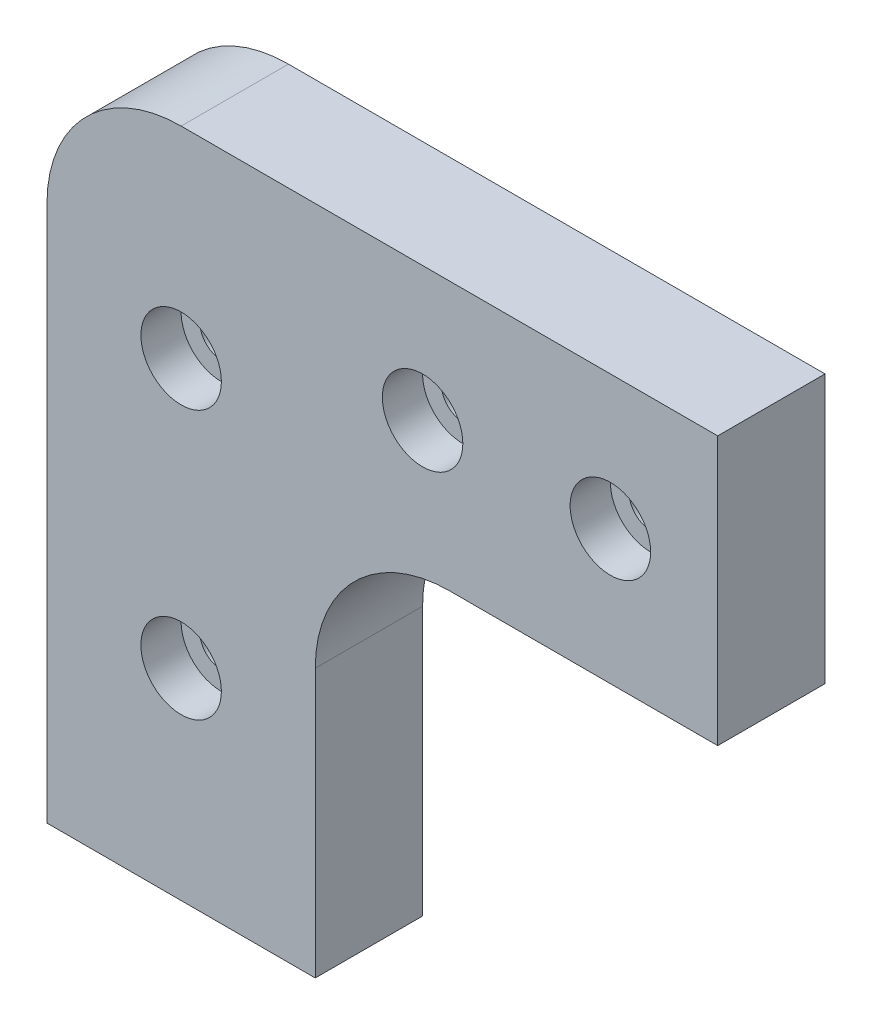
ISO-10303-21;
HEADER;
FILE_DESCRIPTION(('STEP AP214'),'2;1');
FILE_NAME('part.step','',(''),(''),'','','');
FILE_SCHEMA(('AUTOMOTIVE_DESIGN { 1 0 10303 214 1 1 1 1 }'));
ENDSEC;
DATA;
#1=APPLICATION_CONTEXT('core data for automotive mechanical design processes');
#2=APPLICATION_PROTOCOL_DEFINITION('international standard','automotive_design',2000,#1);
#3=PRODUCT_CONTEXT('',#1,'mechanical');
#4=PRODUCT('Part','Part','',(#3));
#5=PRODUCT_RELATED_PRODUCT_CATEGORY('part','',(#4));
#6=PRODUCT_DEFINITION_FORMATION('','',#4);
#7=PRODUCT_DEFINITION_CONTEXT('part definition',#1,'design');
#8=PRODUCT_DEFINITION('design','',#6,#7);
#9=PRODUCT_DEFINITION_SHAPE('','',#8);
#10=(LENGTH_UNIT() NAMED_UNIT(*) SI_UNIT(.MILLI.,.METRE.));
#11=(NAMED_UNIT(*) PLANE_ANGLE_UNIT() SI_UNIT($,.RADIAN.));
#12=(NAMED_UNIT(*) SI_UNIT($,.STERADIAN.) SOLID_ANGLE_UNIT());
#13=UNCERTAINTY_MEASURE_WITH_UNIT(LENGTH_MEASURE(1.E-05),#10,'distance_accuracy_value','');
#14=(GEOMETRIC_REPRESENTATION_CONTEXT(3) GLOBAL_UNCERTAINTY_ASSIGNED_CONTEXT((#13)) GLOBAL_UNIT_ASSIGNED_CONTEXT((#10,
#11,#12)) REPRESENTATION_CONTEXT('',''));
#15=CARTESIAN_POINT('',(0.,0.,0.));
#16=DIRECTION('',(0.,0.,1.));
#17=DIRECTION('',(1.,0.,0.));
#18=AXIS2_PLACEMENT_3D('',#15,#16,#17);
#19=CARTESIAN_POINT('',(32.,67.5,8.));
#20=DIRECTION('',(0.,0.,-1.));
#21=DIRECTION('',(-1.,0.,0.));
#22=AXIS2_PLACEMENT_3D('',#19,#20,#21);
#23=CYLINDRICAL_SURFACE('',#22,1.6);
#24=CARTESIAN_POINT('',(32.,67.5,0.));
#25=DIRECTION('',(0.,0.,1.));
#26=DIRECTION('',(1.,0.,0.));
#27=AXIS2_PLACEMENT_3D('',#24,#25,#26);
#28=CIRCLE('',#27,1.6);
#29=CARTESIAN_POINT('',(33.6,67.5,0.));
#30=VERTEX_POINT('',#29);
#31=EDGE_CURVE('E228',#30,#30,#28,.T.);
#32=ORIENTED_EDGE('',*,*,#31,.F.);
#33=EDGE_LOOP('',(#32));
#34=FACE_BOUND('',#33,.T.);
#35=CARTESIAN_POINT('',(32.,67.5,5.));
#36=DIRECTION('',(0.,0.,1.));
#37=DIRECTION('',(1.,0.,0.));
#38=AXIS2_PLACEMENT_3D('',#35,#36,#37);
#39=CIRCLE('',#38,1.6);
#40=CARTESIAN_POINT('',(33.6,67.5,5.));
#41=VERTEX_POINT('',#40);
#42=EDGE_CURVE('E171',#41,#41,#39,.T.);
#43=ORIENTED_EDGE('',*,*,#42,.T.);
#44=EDGE_LOOP('',(#43));
#45=FACE_BOUND('',#44,.T.);
#46=ADVANCED_FACE('F49',(#34,#45),#23,.F.);
#47=CARTESIAN_POINT('',(18.,67.5,8.));
#48=DIRECTION('',(0.,0.,-1.));
#49=DIRECTION('',(-1.,0.,0.));
#50=AXIS2_PLACEMENT_3D('',#47,#48,#49);
#51=CYLINDRICAL_SURFACE('',#50,1.60000000000001);
#52=CARTESIAN_POINT('',(18.,67.5,0.));
#53=DIRECTION('',(0.,0.,1.));
#54=DIRECTION('',(1.,0.,0.));
#55=AXIS2_PLACEMENT_3D('',#52,#53,#54);
#56=CIRCLE('',#55,1.60000000000001);
#57=CARTESIAN_POINT('',(19.6,67.5,0.));
#58=VERTEX_POINT('',#57);
#59=EDGE_CURVE('E492',#58,#58,#56,.T.);
#60=ORIENTED_EDGE('',*,*,#59,.F.);
#61=EDGE_LOOP('',(#60));
#62=FACE_BOUND('',#61,.T.);
#63=CARTESIAN_POINT('',(18.,67.5,5.));
#64=DIRECTION('',(0.,0.,1.));
#65=DIRECTION('',(1.,0.,0.));
#66=AXIS2_PLACEMENT_3D('',#63,#64,#65);
#67=CIRCLE('',#66,1.60000000000001);
#68=CARTESIAN_POINT('',(19.6,67.5,5.));
#69=VERTEX_POINT('',#68);
#70=EDGE_CURVE('E167',#69,#69,#67,.T.);
#71=ORIENTED_EDGE('',*,*,#70,.T.);
#72=EDGE_LOOP('',(#71));
#73=FACE_BOUND('',#72,.T.);
#74=ADVANCED_FACE('F252',(#62,#73),#51,.F.);
#75=CARTESIAN_POINT('',(0.,62.5,8.));
#76=DIRECTION('',(0.,0.,-1.));
#77=DIRECTION('',(-1.,0.,0.));
#78=AXIS2_PLACEMENT_3D('',#75,#76,#77);
#79=CYLINDRICAL_SURFACE('',#78,1.6);
#80=CARTESIAN_POINT('',(0.,62.5,0.));
#81=DIRECTION('',(0.,0.,1.));
#82=DIRECTION('',(1.,0.,0.));
#83=AXIS2_PLACEMENT_3D('',#80,#81,#82);
#84=CIRCLE('',#83,1.6);
#85=CARTESIAN_POINT('',(1.60000000000002,62.5,0.));
#86=VERTEX_POINT('',#85);
#87=EDGE_CURVE('E488',#86,#86,#84,.T.);
#88=ORIENTED_EDGE('',*,*,#87,.F.);
#89=EDGE_LOOP('',(#88));
#90=FACE_BOUND('',#89,.T.);
#91=CARTESIAN_POINT('',(0.,62.5,5.));
#92=DIRECTION('',(0.,0.,1.));
#93=DIRECTION('',(1.,0.,0.));
#94=AXIS2_PLACEMENT_3D('',#91,#92,#93);
#95=CIRCLE('',#94,1.6);
#96=CARTESIAN_POINT('',(1.60000000000002,62.5,5.));
#97=VERTEX_POINT('',#96);
#98=EDGE_CURVE('E162',#97,#97,#95,.T.);
#99=ORIENTED_EDGE('',*,*,#98,.T.);
#100=EDGE_LOOP('',(#99));
#101=FACE_BOUND('',#100,.T.);
#102=ADVANCED_FACE('F257',(#90,#101),#79,.F.);
#103=CARTESIAN_POINT('',(0.,42.5,8.));
#104=DIRECTION('',(0.,0.,-1.));
#105=DIRECTION('',(-1.,0.,0.));
#106=AXIS2_PLACEMENT_3D('',#103,#104,#105);
#107=CYLINDRICAL_SURFACE('',#106,1.6);
#108=CARTESIAN_POINT('',(0.,42.5,0.));
#109=DIRECTION('',(0.,0.,1.));
#110=DIRECTION('',(1.,0.,0.));
#111=AXIS2_PLACEMENT_3D('',#108,#109,#110);
#112=CIRCLE('',#111,1.6);
#113=CARTESIAN_POINT('',(1.60000000000002,42.5,0.));
#114=VERTEX_POINT('',#113);
#115=EDGE_CURVE('E174',#114,#114,#112,.T.);
#116=ORIENTED_EDGE('',*,*,#115,.F.);
#117=EDGE_LOOP('',(#116));
#118=FACE_BOUND('',#117,.T.);
#119=CARTESIAN_POINT('',(0.,42.5,5.));
#120=DIRECTION('',(0.,0.,1.));
#121=DIRECTION('',(1.,0.,0.));
#122=AXIS2_PLACEMENT_3D('',#119,#120,#121);
#123=CIRCLE('',#122,1.6);
#124=CARTESIAN_POINT('',(1.60000000000002,42.5,5.));
#125=VERTEX_POINT('',#124);
#126=EDGE_CURVE('E158',#125,#125,#123,.T.);
#127=ORIENTED_EDGE('',*,*,#126,.T.);
#128=EDGE_LOOP('',(#127));
#129=FACE_BOUND('',#128,.T.);
#130=ADVANCED_FACE('F266',(#118,#129),#107,.F.);
#131=CARTESIAN_POINT('',(0.,0.,8.));
#132=DIRECTION('',(0.,0.,-1.));
#133=DIRECTION('',(-1.,0.,0.));
#134=AXIS2_PLACEMENT_3D('',#131,#132,#133);
#135=PLANE('',#134);
#136=CARTESIAN_POINT('',(32.,67.5,8.));
#137=DIRECTION('',(0.,0.,1.));
#138=DIRECTION('',(1.,0.,0.));
#139=AXIS2_PLACEMENT_3D('',#136,#137,#138);
#140=CIRCLE('',#139,3.);
#141=CARTESIAN_POINT('',(35.,67.5,8.));
#142=VERTEX_POINT('',#141);
#143=EDGE_CURVE('E527',#142,#142,#140,.T.);
#144=ORIENTED_EDGE('',*,*,#143,.F.);
#145=EDGE_LOOP('',(#144));
#146=FACE_BOUND('',#145,.T.);
#147=CARTESIAN_POINT('',(18.,67.5,8.));
#148=DIRECTION('',(0.,0.,1.));
#149=DIRECTION('',(1.,0.,0.));
#150=AXIS2_PLACEMENT_3D('',#147,#148,#149);
#151=CIRCLE('',#150,3.);
#152=CARTESIAN_POINT('',(21.,67.5,8.));
#153=VERTEX_POINT('',#152);
#154=EDGE_CURVE('E513',#153,#153,#151,.T.);
#155=ORIENTED_EDGE('',*,*,#154,.F.);
#156=EDGE_LOOP('',(#155));
#157=FACE_BOUND('',#156,.T.);
#158=CARTESIAN_POINT('',(0.,62.5,8.));
#159=DIRECTION('',(0.,0.,1.));
#160=DIRECTION('',(1.,0.,0.));
#161=AXIS2_PLACEMENT_3D('',#158,#159,#160);
#162=CIRCLE('',#161,3.);
#163=CARTESIAN_POINT('',(3.00000000000002,62.5,8.));
#164=VERTEX_POINT('',#163);
#165=EDGE_CURVE('E514',#164,#164,#162,.T.);
#166=ORIENTED_EDGE('',*,*,#165,.F.);
#167=EDGE_LOOP('',(#166));
#168=FACE_BOUND('',#167,.T.);
#169=CARTESIAN_POINT('',(0.,42.5,8.));
#170=DIRECTION('',(0.,0.,1.));
#171=DIRECTION('',(1.,0.,0.));
#172=AXIS2_PLACEMENT_3D('',#169,#170,#171);
#173=CIRCLE('',#172,3.);
#174=CARTESIAN_POINT('',(3.00000000000002,42.5,8.));
#175=VERTEX_POINT('',#174);
#176=EDGE_CURVE('E478',#175,#175,#173,.T.);
#177=ORIENTED_EDGE('',*,*,#176,.F.);
#178=EDGE_LOOP('',(#177));
#179=FACE_BOUND('',#178,.T.);
#180=DIRECTION('',(-1.,0.,0.));
#181=VECTOR('',#180,1.);
#182=CARTESIAN_POINT('',(-9.99999999999999,77.5,8.));
#183=LINE('',#182,#181);
#184=CARTESIAN_POINT('',(40.,77.5,8.));
#185=VERTEX_POINT('',#184);
#186=CARTESIAN_POINT('',(0.,77.5,8.));
#187=VERTEX_POINT('',#186);
#188=EDGE_CURVE('E218',#185,#187,#183,.T.);
#189=ORIENTED_EDGE('',*,*,#188,.T.);
#190=CARTESIAN_POINT('',(0.,67.5,8.));
#191=DIRECTION('',(0.,0.,-1.));
#192=DIRECTION('',(-1.,0.,0.));
#193=AXIS2_PLACEMENT_3D('',#190,#191,#192);
#194=CIRCLE('',#193,10.);
#195=CARTESIAN_POINT('',(-9.99999999999999,67.5,8.));
#196=VERTEX_POINT('',#195);
#197=EDGE_CURVE('E122',#187,#196,#194,.F.);
#198=ORIENTED_EDGE('',*,*,#197,.T.);
#199=DIRECTION('',(0.,-1.,0.));
#200=VECTOR('',#199,1.);
#201=CARTESIAN_POINT('',(-9.99999999999999,77.5,8.));
#202=LINE('',#201,#200);
#203=CARTESIAN_POINT('',(-9.99999999999999,27.5,8.));
#204=VERTEX_POINT('',#203);
#205=EDGE_CURVE('E115',#196,#204,#202,.T.);
#206=ORIENTED_EDGE('',*,*,#205,.T.);
#207=DIRECTION('',(1.,0.,0.));
#208=VECTOR('',#207,1.);
#209=CARTESIAN_POINT('',(10.,27.5,8.));
#210=LINE('',#209,#208);
#211=CARTESIAN_POINT('',(10.,27.5,8.));
#212=VERTEX_POINT('',#211);
#213=EDGE_CURVE('E119',#204,#212,#210,.T.);
#214=ORIENTED_EDGE('',*,*,#213,.T.);
#215=DIRECTION('',(0.,1.,0.));
#216=VECTOR('',#215,1.);
#217=CARTESIAN_POINT('',(10.,57.5,8.));
#218=LINE('',#217,#216);
#219=CARTESIAN_POINT('',(10.,47.5,8.));
#220=VERTEX_POINT('',#219);
#221=EDGE_CURVE('E138',#212,#220,#218,.T.);
#222=ORIENTED_EDGE('',*,*,#221,.T.);
#223=CARTESIAN_POINT('',(20.,47.5,8.));
#224=DIRECTION('',(0.,0.,-1.));
#225=DIRECTION('',(-1.,0.,0.));
#226=AXIS2_PLACEMENT_3D('',#223,#224,#225);
#227=CIRCLE('',#226,10.);
#228=CARTESIAN_POINT('',(20.,57.5,8.));
#229=VERTEX_POINT('',#228);
#230=EDGE_CURVE('E11',#220,#229,#227,.T.);
#231=ORIENTED_EDGE('',*,*,#230,.T.);
#232=DIRECTION('',(1.,0.,0.));
#233=VECTOR('',#232,1.);
#234=CARTESIAN_POINT('',(10.,57.5,8.));
#235=LINE('',#234,#233);
#236=CARTESIAN_POINT('',(40.,57.5,8.));
#237=VERTEX_POINT('',#236);
#238=EDGE_CURVE('E208',#229,#237,#235,.T.);
#239=ORIENTED_EDGE('',*,*,#238,.T.);
#240=DIRECTION('',(0.,1.,0.));
#241=VECTOR('',#240,1.);
#242=CARTESIAN_POINT('',(40.,77.5,8.));
#243=LINE('',#242,#241);
#244=EDGE_CURVE('E215',#237,#185,#243,.T.);
#245=ORIENTED_EDGE('',*,*,#244,.T.);
#246=EDGE_LOOP('',(#189,#198,#206,#214,#222,#231,#239,#245));
#247=FACE_BOUND('',#246,.T.);
#248=ADVANCED_FACE('F117',(#146,#157,#168,#179,#247),#135,.F.);
#249=CARTESIAN_POINT('',(0.,0.,0.));
#250=DIRECTION('',(0.,0.,-1.));
#251=DIRECTION('',(-1.,0.,0.));
#252=AXIS2_PLACEMENT_3D('',#249,#250,#251);
#253=PLANE('',#252);
#254=ORIENTED_EDGE('',*,*,#87,.T.);
#255=EDGE_LOOP('',(#254));
#256=FACE_BOUND('',#255,.T.);
#257=ORIENTED_EDGE('',*,*,#31,.T.);
#258=EDGE_LOOP('',(#257));
#259=FACE_BOUND('',#258,.T.);
#260=DIRECTION('',(0.,-1.,0.));
#261=VECTOR('',#260,1.);
#262=CARTESIAN_POINT('',(-9.99999999999999,77.5,0.));
#263=LINE('',#262,#261);
#264=CARTESIAN_POINT('',(-9.99999999999999,67.5,0.));
#265=VERTEX_POINT('',#264);
#266=CARTESIAN_POINT('',(-9.99999999999999,27.5,0.));
#267=VERTEX_POINT('',#266);
#268=EDGE_CURVE('E141',#265,#267,#263,.T.);
#269=ORIENTED_EDGE('',*,*,#268,.F.);
#270=CARTESIAN_POINT('',(0.,67.5,0.));
#271=DIRECTION('',(0.,0.,-1.));
#272=DIRECTION('',(-1.,0.,0.));
#273=AXIS2_PLACEMENT_3D('',#270,#271,#272);
#274=CIRCLE('',#273,10.);
#275=CARTESIAN_POINT('',(0.,77.5,0.));
#276=VERTEX_POINT('',#275);
#277=EDGE_CURVE('E73',#265,#276,#274,.T.);
#278=ORIENTED_EDGE('',*,*,#277,.T.);
#279=DIRECTION('',(-1.,0.,0.));
#280=VECTOR('',#279,1.);
#281=CARTESIAN_POINT('',(-9.99999999999999,77.5,0.));
#282=LINE('',#281,#280);
#283=CARTESIAN_POINT('',(40.,77.5,0.));
#284=VERTEX_POINT('',#283);
#285=EDGE_CURVE('E128',#284,#276,#282,.T.);
#286=ORIENTED_EDGE('',*,*,#285,.F.);
#287=DIRECTION('',(0.,1.,0.));
#288=VECTOR('',#287,1.);
#289=CARTESIAN_POINT('',(40.,77.5,0.));
#290=LINE('',#289,#288);
#291=CARTESIAN_POINT('',(40.,57.5,0.));
#292=VERTEX_POINT('',#291);
#293=EDGE_CURVE('E233',#292,#284,#290,.T.);
#294=ORIENTED_EDGE('',*,*,#293,.F.);
#295=DIRECTION('',(1.,0.,0.));
#296=VECTOR('',#295,1.);
#297=CARTESIAN_POINT('',(10.,57.5,0.));
#298=LINE('',#297,#296);
#299=CARTESIAN_POINT('',(20.,57.5,0.));
#300=VERTEX_POINT('',#299);
#301=EDGE_CURVE('E196',#300,#292,#298,.T.);
#302=ORIENTED_EDGE('',*,*,#301,.F.);
#303=CARTESIAN_POINT('',(20.,47.5,0.));
#304=DIRECTION('',(0.,0.,-1.));
#305=DIRECTION('',(-1.,0.,0.));
#306=AXIS2_PLACEMENT_3D('',#303,#304,#305);
#307=CIRCLE('',#306,10.);
#308=CARTESIAN_POINT('',(10.,47.5,0.));
#309=VERTEX_POINT('',#308);
#310=EDGE_CURVE('E58',#300,#309,#307,.F.);
#311=ORIENTED_EDGE('',*,*,#310,.T.);
#312=DIRECTION('',(0.,1.,0.));
#313=VECTOR('',#312,1.);
#314=CARTESIAN_POINT('',(10.,57.5,0.));
#315=LINE('',#314,#313);
#316=CARTESIAN_POINT('',(10.,27.5,0.));
#317=VERTEX_POINT('',#316);
#318=EDGE_CURVE('E194',#317,#309,#315,.T.);
#319=ORIENTED_EDGE('',*,*,#318,.F.);
#320=DIRECTION('',(1.,0.,0.));
#321=VECTOR('',#320,1.);
#322=CARTESIAN_POINT('',(10.,27.5,0.));
#323=LINE('',#322,#321);
#324=EDGE_CURVE('E203',#267,#317,#323,.T.);
#325=ORIENTED_EDGE('',*,*,#324,.F.);
#326=EDGE_LOOP('',(#269,#278,#286,#294,#302,#311,#319,#325));
#327=FACE_BOUND('',#326,.T.);
#328=ORIENTED_EDGE('',*,*,#59,.T.);
#329=EDGE_LOOP('',(#328));
#330=FACE_BOUND('',#329,.T.);
#331=ORIENTED_EDGE('',*,*,#115,.T.);
#332=EDGE_LOOP('',(#331));
#333=FACE_BOUND('',#332,.T.);
#334=ADVANCED_FACE('F192',(#256,#259,#327,#330,#333),#253,.T.);
#335=CARTESIAN_POINT('',(-9.99999999999999,77.5,8.));
#336=DIRECTION('',(1.,0.,0.));
#337=DIRECTION('',(0.,1.,0.));
#338=AXIS2_PLACEMENT_3D('',#335,#336,#337);
#339=PLANE('',#338);
#340=ORIENTED_EDGE('',*,*,#205,.F.);
#341=DIRECTION('',(0.,0.,-1.));
#342=VECTOR('',#341,1.);
#343=CARTESIAN_POINT('',(-9.99999999999999,67.5,8.));
#344=LINE('',#343,#342);
#345=EDGE_CURVE('E178',#196,#265,#344,.T.);
#346=ORIENTED_EDGE('',*,*,#345,.T.);
#347=ORIENTED_EDGE('',*,*,#268,.T.);
#348=DIRECTION('',(0.,0.,-1.));
#349=VECTOR('',#348,1.);
#350=CARTESIAN_POINT('',(-9.99999999999999,27.5,8.));
#351=LINE('',#350,#349);
#352=EDGE_CURVE('E133',#204,#267,#351,.T.);
#353=ORIENTED_EDGE('',*,*,#352,.F.);
#354=EDGE_LOOP('',(#340,#346,#347,#353));
#355=FACE_BOUND('',#354,.T.);
#356=ADVANCED_FACE('F140',(#355),#339,.F.);
#357=CARTESIAN_POINT('',(10.,27.5,8.));
#358=DIRECTION('',(0.,1.,0.));
#359=DIRECTION('',(0.,0.,1.));
#360=AXIS2_PLACEMENT_3D('',#357,#358,#359);
#361=PLANE('',#360);
#362=ORIENTED_EDGE('',*,*,#324,.T.);
#363=DIRECTION('',(0.,0.,-1.));
#364=VECTOR('',#363,1.);
#365=CARTESIAN_POINT('',(10.,27.5,8.));
#366=LINE('',#365,#364);
#367=EDGE_CURVE('E135',#212,#317,#366,.T.);
#368=ORIENTED_EDGE('',*,*,#367,.F.);
#369=ORIENTED_EDGE('',*,*,#213,.F.);
#370=ORIENTED_EDGE('',*,*,#352,.T.);
#371=EDGE_LOOP('',(#362,#368,#369,#370));
#372=FACE_BOUND('',#371,.T.);
#373=ADVANCED_FACE('F132',(#372),#361,.F.);
#374=CARTESIAN_POINT('',(10.,57.5,8.));
#375=DIRECTION('',(-1.,0.,0.));
#376=DIRECTION('',(0.,-1.,0.));
#377=AXIS2_PLACEMENT_3D('',#374,#375,#376);
#378=PLANE('',#377);
#379=ORIENTED_EDGE('',*,*,#318,.T.);
#380=DIRECTION('',(0.,0.,-1.));
#381=VECTOR('',#380,1.);
#382=CARTESIAN_POINT('',(10.,47.5,8.));
#383=LINE('',#382,#381);
#384=EDGE_CURVE('E151',#309,#220,#383,.F.);
#385=ORIENTED_EDGE('',*,*,#384,.T.);
#386=ORIENTED_EDGE('',*,*,#221,.F.);
#387=ORIENTED_EDGE('',*,*,#367,.T.);
#388=EDGE_LOOP('',(#379,#385,#386,#387));
#389=FACE_BOUND('',#388,.T.);
#390=ADVANCED_FACE('F201',(#389),#378,.F.);
#391=CARTESIAN_POINT('',(10.,57.5,8.));
#392=DIRECTION('',(0.,1.,0.));
#393=DIRECTION('',(0.,0.,1.));
#394=AXIS2_PLACEMENT_3D('',#391,#392,#393);
#395=PLANE('',#394);
#396=ORIENTED_EDGE('',*,*,#238,.F.);
#397=DIRECTION('',(0.,0.,-1.));
#398=VECTOR('',#397,1.);
#399=CARTESIAN_POINT('',(20.,57.5,0.));
#400=LINE('',#399,#398);
#401=EDGE_CURVE('E144',#229,#300,#400,.T.);
#402=ORIENTED_EDGE('',*,*,#401,.T.);
#403=ORIENTED_EDGE('',*,*,#301,.T.);
#404=DIRECTION('',(0.,0.,-1.));
#405=VECTOR('',#404,1.);
#406=CARTESIAN_POINT('',(40.,57.5,8.));
#407=LINE('',#406,#405);
#408=EDGE_CURVE('E154',#237,#292,#407,.T.);
#409=ORIENTED_EDGE('',*,*,#408,.F.);
#410=EDGE_LOOP('',(#396,#402,#403,#409));
#411=FACE_BOUND('',#410,.T.);
#412=ADVANCED_FACE('F211',(#411),#395,.F.);
#413=CARTESIAN_POINT('',(40.,77.5,8.));
#414=DIRECTION('',(-1.,0.,0.));
#415=DIRECTION('',(0.,0.,1.));
#416=AXIS2_PLACEMENT_3D('',#413,#414,#415);
#417=PLANE('',#416);
#418=ORIENTED_EDGE('',*,*,#293,.T.);
#419=DIRECTION('',(0.,0.,-1.));
#420=VECTOR('',#419,1.);
#421=CARTESIAN_POINT('',(40.,77.5,8.));
#422=LINE('',#421,#420);
#423=EDGE_CURVE('E225',#185,#284,#422,.T.);
#424=ORIENTED_EDGE('',*,*,#423,.F.);
#425=ORIENTED_EDGE('',*,*,#244,.F.);
#426=ORIENTED_EDGE('',*,*,#408,.T.);
#427=EDGE_LOOP('',(#418,#424,#425,#426));
#428=FACE_BOUND('',#427,.T.);
#429=ADVANCED_FACE('F243',(#428),#417,.F.);
#430=CARTESIAN_POINT('',(-9.99999999999999,77.5,8.));
#431=DIRECTION('',(0.,-1.,0.));
#432=DIRECTION('',(0.,0.,-1.));
#433=AXIS2_PLACEMENT_3D('',#430,#431,#432);
#434=PLANE('',#433);
#435=ORIENTED_EDGE('',*,*,#285,.T.);
#436=DIRECTION('',(0.,0.,-1.));
#437=VECTOR('',#436,1.);
#438=CARTESIAN_POINT('',(0.,77.5,8.));
#439=LINE('',#438,#437);
#440=EDGE_CURVE('E65',#276,#187,#439,.F.);
#441=ORIENTED_EDGE('',*,*,#440,.T.);
#442=ORIENTED_EDGE('',*,*,#188,.F.);
#443=ORIENTED_EDGE('',*,*,#423,.T.);
#444=EDGE_LOOP('',(#435,#441,#442,#443));
#445=FACE_BOUND('',#444,.T.);
#446=ADVANCED_FACE('F245',(#445),#434,.F.);
#447=CARTESIAN_POINT('',(0.,42.5,5.));
#448=DIRECTION('',(0.,0.,1.));
#449=DIRECTION('',(1.,0.,0.));
#450=AXIS2_PLACEMENT_3D('',#447,#448,#449);
#451=CYLINDRICAL_SURFACE('',#450,3.);
#452=CARTESIAN_POINT('',(0.,42.5,5.));
#453=DIRECTION('',(0.,0.,1.));
#454=DIRECTION('',(1.,0.,0.));
#455=AXIS2_PLACEMENT_3D('',#452,#453,#454);
#456=CIRCLE('',#455,3.);
#457=CARTESIAN_POINT('',(3.00000000000002,42.5,5.));
#458=VERTEX_POINT('',#457);
#459=EDGE_CURVE('E477',#458,#458,#456,.T.);
#460=ORIENTED_EDGE('',*,*,#459,.F.);
#461=EDGE_LOOP('',(#460));
#462=FACE_BOUND('',#461,.T.);
#463=ORIENTED_EDGE('',*,*,#176,.T.);
#464=EDGE_LOOP('',(#463));
#465=FACE_BOUND('',#464,.T.);
#466=ADVANCED_FACE('F273',(#462,#465),#451,.F.);
#467=CARTESIAN_POINT('',(0.,42.5,5.));
#468=DIRECTION('',(0.,0.,1.));
#469=DIRECTION('',(1.,0.,0.));
#470=AXIS2_PLACEMENT_3D('',#467,#468,#469);
#471=PLANE('',#470);
#472=ORIENTED_EDGE('',*,*,#126,.F.);
#473=EDGE_LOOP('',(#472));
#474=FACE_BOUND('',#473,.T.);
#475=ORIENTED_EDGE('',*,*,#459,.T.);
#476=EDGE_LOOP('',(#475));
#477=FACE_BOUND('',#476,.T.);
#478=ADVANCED_FACE('F306',(#474,#477),#471,.T.);
#479=CARTESIAN_POINT('',(0.,62.5,5.));
#480=DIRECTION('',(0.,0.,1.));
#481=DIRECTION('',(1.,0.,0.));
#482=AXIS2_PLACEMENT_3D('',#479,#480,#481);
#483=CYLINDRICAL_SURFACE('',#482,3.);
#484=CARTESIAN_POINT('',(0.,62.5,5.));
#485=DIRECTION('',(0.,0.,1.));
#486=DIRECTION('',(1.,0.,0.));
#487=AXIS2_PLACEMENT_3D('',#484,#485,#486);
#488=CIRCLE('',#487,3.);
#489=CARTESIAN_POINT('',(3.00000000000002,62.5,5.));
#490=VERTEX_POINT('',#489);
#491=EDGE_CURVE('E482',#490,#490,#488,.T.);
#492=ORIENTED_EDGE('',*,*,#491,.F.);
#493=EDGE_LOOP('',(#492));
#494=FACE_BOUND('',#493,.T.);
#495=ORIENTED_EDGE('',*,*,#165,.T.);
#496=EDGE_LOOP('',(#495));
#497=FACE_BOUND('',#496,.T.);
#498=ADVANCED_FACE('F314',(#494,#497),#483,.F.);
#499=CARTESIAN_POINT('',(0.,62.5,5.));
#500=DIRECTION('',(0.,0.,1.));
#501=DIRECTION('',(1.,0.,0.));
#502=AXIS2_PLACEMENT_3D('',#499,#500,#501);
#503=PLANE('',#502);
#504=ORIENTED_EDGE('',*,*,#98,.F.);
#505=EDGE_LOOP('',(#504));
#506=FACE_BOUND('',#505,.T.);
#507=ORIENTED_EDGE('',*,*,#491,.T.);
#508=EDGE_LOOP('',(#507));
#509=FACE_BOUND('',#508,.T.);
#510=ADVANCED_FACE('F321',(#506,#509),#503,.T.);
#511=CARTESIAN_POINT('',(18.,67.5,5.));
#512=DIRECTION('',(0.,0.,1.));
#513=DIRECTION('',(1.,0.,0.));
#514=AXIS2_PLACEMENT_3D('',#511,#512,#513);
#515=CYLINDRICAL_SURFACE('',#514,3.);
#516=CARTESIAN_POINT('',(18.,67.5,5.));
#517=DIRECTION('',(0.,0.,1.));
#518=DIRECTION('',(1.,0.,0.));
#519=AXIS2_PLACEMENT_3D('',#516,#517,#518);
#520=CIRCLE('',#519,3.);
#521=CARTESIAN_POINT('',(21.,67.5,5.));
#522=VERTEX_POINT('',#521);
#523=EDGE_CURVE('E510',#522,#522,#520,.T.);
#524=ORIENTED_EDGE('',*,*,#523,.F.);
#525=EDGE_LOOP('',(#524));
#526=FACE_BOUND('',#525,.T.);
#527=ORIENTED_EDGE('',*,*,#154,.T.);
#528=EDGE_LOOP('',(#527));
#529=FACE_BOUND('',#528,.T.);
#530=ADVANCED_FACE('F328',(#526,#529),#515,.F.);
#531=CARTESIAN_POINT('',(18.,67.5,5.));
#532=DIRECTION('',(0.,0.,1.));
#533=DIRECTION('',(1.,0.,0.));
#534=AXIS2_PLACEMENT_3D('',#531,#532,#533);
#535=PLANE('',#534);
#536=ORIENTED_EDGE('',*,*,#70,.F.);
#537=EDGE_LOOP('',(#536));
#538=FACE_BOUND('',#537,.T.);
#539=ORIENTED_EDGE('',*,*,#523,.T.);
#540=EDGE_LOOP('',(#539));
#541=FACE_BOUND('',#540,.T.);
#542=ADVANCED_FACE('F335',(#538,#541),#535,.T.);
#543=CARTESIAN_POINT('',(32.,67.5,5.));
#544=DIRECTION('',(0.,0.,1.));
#545=DIRECTION('',(1.,0.,0.));
#546=AXIS2_PLACEMENT_3D('',#543,#544,#545);
#547=CYLINDRICAL_SURFACE('',#546,3.);
#548=CARTESIAN_POINT('',(32.,67.5,5.));
#549=DIRECTION('',(0.,0.,1.));
#550=DIRECTION('',(1.,0.,0.));
#551=AXIS2_PLACEMENT_3D('',#548,#549,#550);
#552=CIRCLE('',#551,3.);
#553=CARTESIAN_POINT('',(35.,67.5,5.));
#554=VERTEX_POINT('',#553);
#555=EDGE_CURVE('E163',#554,#554,#552,.T.);
#556=ORIENTED_EDGE('',*,*,#555,.F.);
#557=EDGE_LOOP('',(#556));
#558=FACE_BOUND('',#557,.T.);
#559=ORIENTED_EDGE('',*,*,#143,.T.);
#560=EDGE_LOOP('',(#559));
#561=FACE_BOUND('',#560,.T.);
#562=ADVANCED_FACE('F342',(#558,#561),#547,.F.);
#563=CARTESIAN_POINT('',(32.,67.5,5.));
#564=DIRECTION('',(0.,0.,1.));
#565=DIRECTION('',(1.,0.,0.));
#566=AXIS2_PLACEMENT_3D('',#563,#564,#565);
#567=PLANE('',#566);
#568=ORIENTED_EDGE('',*,*,#42,.F.);
#569=EDGE_LOOP('',(#568));
#570=FACE_BOUND('',#569,.T.);
#571=ORIENTED_EDGE('',*,*,#555,.T.);
#572=EDGE_LOOP('',(#571));
#573=FACE_BOUND('',#572,.T.);
#574=ADVANCED_FACE('F250',(#570,#573),#567,.T.);
#575=CARTESIAN_POINT('',(20.,47.5,8.));
#576=DIRECTION('',(0.,0.,1.));
#577=DIRECTION('',(1.,0.,0.));
#578=AXIS2_PLACEMENT_3D('',#575,#576,#577);
#579=CYLINDRICAL_SURFACE('',#578,10.);
#580=ORIENTED_EDGE('',*,*,#230,.F.);
#581=ORIENTED_EDGE('',*,*,#384,.F.);
#582=ORIENTED_EDGE('',*,*,#310,.F.);
#583=ORIENTED_EDGE('',*,*,#401,.F.);
#584=EDGE_LOOP('',(#580,#581,#582,#583));
#585=FACE_BOUND('',#584,.T.);
#586=ADVANCED_FACE('F206',(#585),#579,.F.);
#587=CARTESIAN_POINT('',(0.,67.5,8.));
#588=DIRECTION('',(0.,0.,-1.));
#589=DIRECTION('',(-1.,0.,0.));
#590=AXIS2_PLACEMENT_3D('',#587,#588,#589);
#591=CYLINDRICAL_SURFACE('',#590,10.);
#592=ORIENTED_EDGE('',*,*,#197,.F.);
#593=ORIENTED_EDGE('',*,*,#440,.F.);
#594=ORIENTED_EDGE('',*,*,#277,.F.);
#595=ORIENTED_EDGE('',*,*,#345,.F.);
#596=EDGE_LOOP('',(#592,#593,#594,#595));
#597=FACE_BOUND('',#596,.T.);
#598=ADVANCED_FACE('F51',(#597),#591,.T.);
#599=CLOSED_SHELL('',(#46,#74,#102,#130,#248,#334,#356,#373,#390,#412,#429,#446,#466,#478,#498,
#510,#530,#542,#562,#574,#586,#598));
#600=MANIFOLD_SOLID_BREP('B2',#599);
#601=ADVANCED_BREP_SHAPE_REPRESENTATION('',(#18,#600),#14);
#602=SHAPE_DEFINITION_REPRESENTATION(#9,#601);
ENDSEC;
END-ISO-10303-21;
